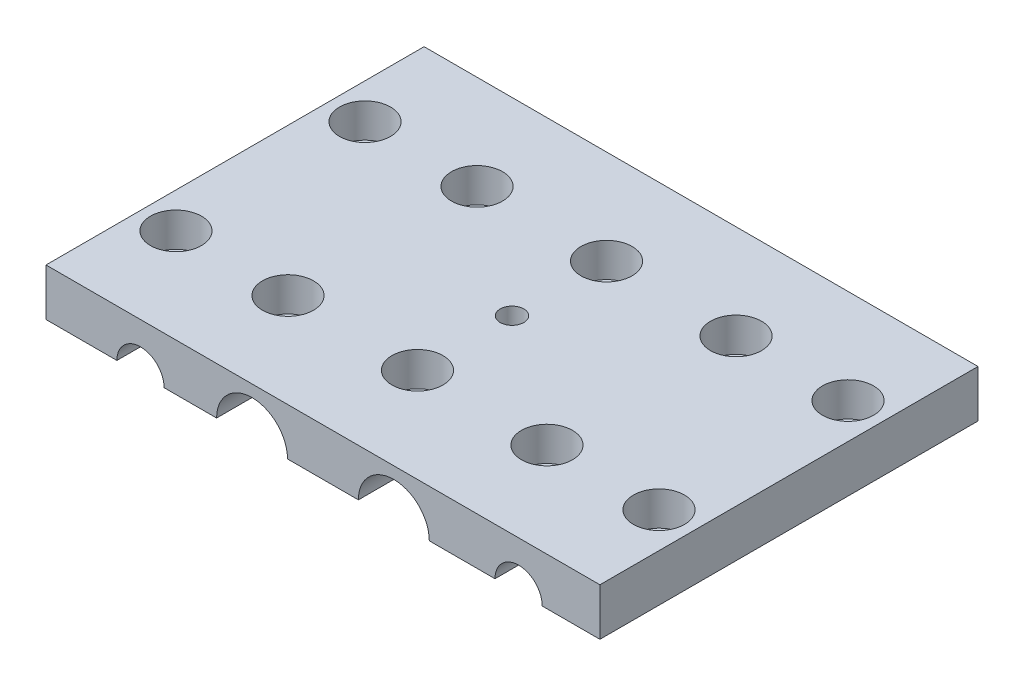
ISO-10303-21;
HEADER;
FILE_DESCRIPTION(('STEP AP214'),'2;1');
FILE_NAME('part.step','',(''),(''),'','','');
FILE_SCHEMA(('AUTOMOTIVE_DESIGN { 1 0 10303 214 1 1 1 1 }'));
ENDSEC;
DATA;
#1=APPLICATION_CONTEXT('core data for automotive mechanical design processes');
#2=APPLICATION_PROTOCOL_DEFINITION('international standard','automotive_design',2000,#1);
#3=PRODUCT_CONTEXT('',#1,'mechanical');
#4=PRODUCT('Part','Part','',(#3));
#5=PRODUCT_RELATED_PRODUCT_CATEGORY('part','',(#4));
#6=PRODUCT_DEFINITION_FORMATION('','',#4);
#7=PRODUCT_DEFINITION_CONTEXT('part definition',#1,'design');
#8=PRODUCT_DEFINITION('design','',#6,#7);
#9=PRODUCT_DEFINITION_SHAPE('','',#8);
#10=(LENGTH_UNIT() NAMED_UNIT(*) SI_UNIT(.MILLI.,.METRE.));
#11=(NAMED_UNIT(*) PLANE_ANGLE_UNIT() SI_UNIT($,.RADIAN.));
#12=(NAMED_UNIT(*) SI_UNIT($,.STERADIAN.) SOLID_ANGLE_UNIT());
#13=UNCERTAINTY_MEASURE_WITH_UNIT(LENGTH_MEASURE(1.E-05),#10,'distance_accuracy_value','');
#14=(GEOMETRIC_REPRESENTATION_CONTEXT(3) GLOBAL_UNCERTAINTY_ASSIGNED_CONTEXT((#13)) GLOBAL_UNIT_ASSIGNED_CONTEXT((#10,
#11,#12)) REPRESENTATION_CONTEXT('',''));
#15=CARTESIAN_POINT('',(0.,0.,0.));
#16=DIRECTION('',(0.,0.,1.));
#17=DIRECTION('',(1.,0.,0.));
#18=AXIS2_PLACEMENT_3D('',#15,#16,#17);
#19=CARTESIAN_POINT('',(-32.4485,6.35,12.7));
#20=DIRECTION('',(0.,1.,0.));
#21=DIRECTION('',(0.,0.,1.));
#22=AXIS2_PLACEMENT_3D('',#19,#20,#21);
#23=CYLINDRICAL_SURFACE('',#22,2.2479);
#24=CARTESIAN_POINT('',(-32.4485,0.,12.7));
#25=DIRECTION('',(0.,1.,0.));
#26=DIRECTION('',(0.,0.,1.));
#27=AXIS2_PLACEMENT_3D('',#24,#25,#26);
#28=CIRCLE('',#27,2.2479);
#29=CARTESIAN_POINT('',(-32.4485,0.,14.9479));
#30=VERTEX_POINT('',#29);
#31=EDGE_CURVE('E338',#30,#30,#28,.T.);
#32=ORIENTED_EDGE('',*,*,#31,.F.);
#33=EDGE_LOOP('',(#32));
#34=FACE_BOUND('',#33,.T.);
#35=CARTESIAN_POINT('',(-32.4485,1.778,12.7));
#36=DIRECTION('',(0.,1.,0.));
#37=DIRECTION('',(0.,0.,1.));
#38=AXIS2_PLACEMENT_3D('',#35,#36,#37);
#39=CIRCLE('',#38,2.2479);
#40=CARTESIAN_POINT('',(-32.4485,1.778,14.9479));
#41=VERTEX_POINT('',#40);
#42=EDGE_CURVE('E46',#41,#41,#39,.F.);
#43=ORIENTED_EDGE('',*,*,#42,.F.);
#44=EDGE_LOOP('',(#43));
#45=FACE_BOUND('',#44,.T.);
#46=ADVANCED_FACE('F42',(#34,#45),#23,.F.);
#47=CARTESIAN_POINT('',(-17.399,6.35,12.7));
#48=DIRECTION('',(0.,1.,0.));
#49=DIRECTION('',(0.,0.,1.));
#50=AXIS2_PLACEMENT_3D('',#47,#48,#49);
#51=CYLINDRICAL_SURFACE('',#50,2.2479);
#52=CARTESIAN_POINT('',(-17.399,0.,12.7));
#53=DIRECTION('',(0.,1.,0.));
#54=DIRECTION('',(0.,0.,1.));
#55=AXIS2_PLACEMENT_3D('',#52,#53,#54);
#56=CIRCLE('',#55,2.2479);
#57=CARTESIAN_POINT('',(-17.399,0.,14.9479));
#58=VERTEX_POINT('',#57);
#59=EDGE_CURVE('E342',#58,#58,#56,.T.);
#60=ORIENTED_EDGE('',*,*,#59,.F.);
#61=EDGE_LOOP('',(#60));
#62=FACE_BOUND('',#61,.T.);
#63=CARTESIAN_POINT('',(-17.399,1.778,12.7));
#64=DIRECTION('',(0.,1.,0.));
#65=DIRECTION('',(0.,0.,1.));
#66=AXIS2_PLACEMENT_3D('',#63,#64,#65);
#67=CIRCLE('',#66,2.2479);
#68=CARTESIAN_POINT('',(-17.399,1.778,14.9479));
#69=VERTEX_POINT('',#68);
#70=EDGE_CURVE('E254',#69,#69,#67,.F.);
#71=ORIENTED_EDGE('',*,*,#70,.F.);
#72=EDGE_LOOP('',(#71));
#73=FACE_BOUND('',#72,.T.);
#74=ADVANCED_FACE('F474',(#62,#73),#51,.F.);
#75=CARTESIAN_POINT('',(0.,6.35,12.7));
#76=DIRECTION('',(0.,1.,0.));
#77=DIRECTION('',(0.,0.,1.));
#78=AXIS2_PLACEMENT_3D('',#75,#76,#77);
#79=CYLINDRICAL_SURFACE('',#78,2.2479);
#80=CARTESIAN_POINT('',(0.,0.,12.7));
#81=DIRECTION('',(0.,1.,0.));
#82=DIRECTION('',(0.,0.,1.));
#83=AXIS2_PLACEMENT_3D('',#80,#81,#82);
#84=CIRCLE('',#83,2.2479);
#85=CARTESIAN_POINT('',(0.,0.,14.9479));
#86=VERTEX_POINT('',#85);
#87=EDGE_CURVE('E346',#86,#86,#84,.T.);
#88=ORIENTED_EDGE('',*,*,#87,.F.);
#89=EDGE_LOOP('',(#88));
#90=FACE_BOUND('',#89,.T.);
#91=CARTESIAN_POINT('',(0.,1.778,12.7));
#92=DIRECTION('',(0.,1.,0.));
#93=DIRECTION('',(0.,0.,1.));
#94=AXIS2_PLACEMENT_3D('',#91,#92,#93);
#95=CIRCLE('',#94,2.2479);
#96=CARTESIAN_POINT('',(0.,1.778,14.9479));
#97=VERTEX_POINT('',#96);
#98=EDGE_CURVE('E249',#97,#97,#95,.F.);
#99=ORIENTED_EDGE('',*,*,#98,.F.);
#100=EDGE_LOOP('',(#99));
#101=FACE_BOUND('',#100,.T.);
#102=ADVANCED_FACE('F480',(#90,#101),#79,.F.);
#103=CARTESIAN_POINT('',(17.399,6.35,12.7));
#104=DIRECTION('',(0.,1.,0.));
#105=DIRECTION('',(0.,0.,1.));
#106=AXIS2_PLACEMENT_3D('',#103,#104,#105);
#107=CYLINDRICAL_SURFACE('',#106,2.2479);
#108=CARTESIAN_POINT('',(17.399,0.,12.7));
#109=DIRECTION('',(0.,1.,0.));
#110=DIRECTION('',(0.,0.,1.));
#111=AXIS2_PLACEMENT_3D('',#108,#109,#110);
#112=CIRCLE('',#111,2.2479);
#113=CARTESIAN_POINT('',(17.399,0.,14.9479));
#114=VERTEX_POINT('',#113);
#115=EDGE_CURVE('E350',#114,#114,#112,.T.);
#116=ORIENTED_EDGE('',*,*,#115,.F.);
#117=EDGE_LOOP('',(#116));
#118=FACE_BOUND('',#117,.T.);
#119=CARTESIAN_POINT('',(17.399,1.778,12.7));
#120=DIRECTION('',(0.,1.,0.));
#121=DIRECTION('',(0.,0.,1.));
#122=AXIS2_PLACEMENT_3D('',#119,#120,#121);
#123=CIRCLE('',#122,2.2479);
#124=CARTESIAN_POINT('',(17.399,1.778,14.9479));
#125=VERTEX_POINT('',#124);
#126=EDGE_CURVE('E243',#125,#125,#123,.F.);
#127=ORIENTED_EDGE('',*,*,#126,.F.);
#128=EDGE_LOOP('',(#127));
#129=FACE_BOUND('',#128,.T.);
#130=ADVANCED_FACE('F491',(#118,#129),#107,.F.);
#131=CARTESIAN_POINT('',(32.4485,6.35,12.7));
#132=DIRECTION('',(0.,1.,0.));
#133=DIRECTION('',(0.,0.,1.));
#134=AXIS2_PLACEMENT_3D('',#131,#132,#133);
#135=CYLINDRICAL_SURFACE('',#134,2.2479);
#136=CARTESIAN_POINT('',(32.4485,0.,12.7));
#137=DIRECTION('',(0.,1.,0.));
#138=DIRECTION('',(0.,0.,1.));
#139=AXIS2_PLACEMENT_3D('',#136,#137,#138);
#140=CIRCLE('',#139,2.2479);
#141=CARTESIAN_POINT('',(32.4485,0.,14.9479));
#142=VERTEX_POINT('',#141);
#143=EDGE_CURVE('E354',#142,#142,#140,.T.);
#144=ORIENTED_EDGE('',*,*,#143,.F.);
#145=EDGE_LOOP('',(#144));
#146=FACE_BOUND('',#145,.T.);
#147=CARTESIAN_POINT('',(32.4485,1.778,12.7));
#148=DIRECTION('',(0.,1.,0.));
#149=DIRECTION('',(0.,0.,1.));
#150=AXIS2_PLACEMENT_3D('',#147,#148,#149);
#151=CIRCLE('',#150,2.2479);
#152=CARTESIAN_POINT('',(32.4485,1.778,14.9479));
#153=VERTEX_POINT('',#152);
#154=EDGE_CURVE('E237',#153,#153,#151,.F.);
#155=ORIENTED_EDGE('',*,*,#154,.F.);
#156=EDGE_LOOP('',(#155));
#157=FACE_BOUND('',#156,.T.);
#158=ADVANCED_FACE('F495',(#146,#157),#135,.F.);
#159=CARTESIAN_POINT('',(32.4485,6.35,-12.7));
#160=DIRECTION('',(0.,1.,0.));
#161=DIRECTION('',(0.,0.,1.));
#162=AXIS2_PLACEMENT_3D('',#159,#160,#161);
#163=CYLINDRICAL_SURFACE('',#162,2.2479);
#164=CARTESIAN_POINT('',(32.4485,0.,-12.7));
#165=DIRECTION('',(0.,1.,0.));
#166=DIRECTION('',(0.,0.,1.));
#167=AXIS2_PLACEMENT_3D('',#164,#165,#166);
#168=CIRCLE('',#167,2.2479);
#169=CARTESIAN_POINT('',(32.4485,0.,-10.4521));
#170=VERTEX_POINT('',#169);
#171=EDGE_CURVE('E358',#170,#170,#168,.T.);
#172=ORIENTED_EDGE('',*,*,#171,.F.);
#173=EDGE_LOOP('',(#172));
#174=FACE_BOUND('',#173,.T.);
#175=CARTESIAN_POINT('',(32.4485,1.778,-12.7));
#176=DIRECTION('',(0.,1.,0.));
#177=DIRECTION('',(0.,0.,1.));
#178=AXIS2_PLACEMENT_3D('',#175,#176,#177);
#179=CIRCLE('',#178,2.2479);
#180=CARTESIAN_POINT('',(32.4485,1.778,-10.4521));
#181=VERTEX_POINT('',#180);
#182=EDGE_CURVE('E231',#181,#181,#179,.F.);
#183=ORIENTED_EDGE('',*,*,#182,.F.);
#184=EDGE_LOOP('',(#183));
#185=FACE_BOUND('',#184,.T.);
#186=ADVANCED_FACE('F499',(#174,#185),#163,.F.);
#187=CARTESIAN_POINT('',(17.399,6.35,-12.7));
#188=DIRECTION('',(0.,1.,0.));
#189=DIRECTION('',(0.,0.,1.));
#190=AXIS2_PLACEMENT_3D('',#187,#188,#189);
#191=CYLINDRICAL_SURFACE('',#190,2.2479);
#192=CARTESIAN_POINT('',(17.399,0.,-12.7));
#193=DIRECTION('',(0.,1.,0.));
#194=DIRECTION('',(0.,0.,1.));
#195=AXIS2_PLACEMENT_3D('',#192,#193,#194);
#196=CIRCLE('',#195,2.2479);
#197=CARTESIAN_POINT('',(17.399,0.,-10.4521));
#198=VERTEX_POINT('',#197);
#199=EDGE_CURVE('E362',#198,#198,#196,.T.);
#200=ORIENTED_EDGE('',*,*,#199,.F.);
#201=EDGE_LOOP('',(#200));
#202=FACE_BOUND('',#201,.T.);
#203=CARTESIAN_POINT('',(17.399,1.778,-12.7));
#204=DIRECTION('',(0.,1.,0.));
#205=DIRECTION('',(0.,0.,1.));
#206=AXIS2_PLACEMENT_3D('',#203,#204,#205);
#207=CIRCLE('',#206,2.2479);
#208=CARTESIAN_POINT('',(17.399,1.778,-10.4521));
#209=VERTEX_POINT('',#208);
#210=EDGE_CURVE('E225',#209,#209,#207,.F.);
#211=ORIENTED_EDGE('',*,*,#210,.F.);
#212=EDGE_LOOP('',(#211));
#213=FACE_BOUND('',#212,.T.);
#214=ADVANCED_FACE('F503',(#202,#213),#191,.F.);
#215=CARTESIAN_POINT('',(0.,6.35,-12.7));
#216=DIRECTION('',(0.,1.,0.));
#217=DIRECTION('',(0.,0.,1.));
#218=AXIS2_PLACEMENT_3D('',#215,#216,#217);
#219=CYLINDRICAL_SURFACE('',#218,2.2479);
#220=CARTESIAN_POINT('',(0.,0.,-12.7));
#221=DIRECTION('',(0.,1.,0.));
#222=DIRECTION('',(0.,0.,1.));
#223=AXIS2_PLACEMENT_3D('',#220,#221,#222);
#224=CIRCLE('',#223,2.2479);
#225=CARTESIAN_POINT('',(0.,0.,-10.4521));
#226=VERTEX_POINT('',#225);
#227=EDGE_CURVE('E366',#226,#226,#224,.T.);
#228=ORIENTED_EDGE('',*,*,#227,.F.);
#229=EDGE_LOOP('',(#228));
#230=FACE_BOUND('',#229,.T.);
#231=CARTESIAN_POINT('',(0.,1.778,-12.7));
#232=DIRECTION('',(0.,1.,0.));
#233=DIRECTION('',(0.,0.,1.));
#234=AXIS2_PLACEMENT_3D('',#231,#232,#233);
#235=CIRCLE('',#234,2.2479);
#236=CARTESIAN_POINT('',(0.,1.778,-10.4521));
#237=VERTEX_POINT('',#236);
#238=EDGE_CURVE('E219',#237,#237,#235,.F.);
#239=ORIENTED_EDGE('',*,*,#238,.F.);
#240=EDGE_LOOP('',(#239));
#241=FACE_BOUND('',#240,.T.);
#242=ADVANCED_FACE('F507',(#230,#241),#219,.F.);
#243=CARTESIAN_POINT('',(-17.399,6.35,-12.7));
#244=DIRECTION('',(0.,1.,0.));
#245=DIRECTION('',(0.,0.,1.));
#246=AXIS2_PLACEMENT_3D('',#243,#244,#245);
#247=CYLINDRICAL_SURFACE('',#246,2.2479);
#248=CARTESIAN_POINT('',(-17.399,0.,-12.7));
#249=DIRECTION('',(0.,1.,0.));
#250=DIRECTION('',(0.,0.,1.));
#251=AXIS2_PLACEMENT_3D('',#248,#249,#250);
#252=CIRCLE('',#251,2.2479);
#253=CARTESIAN_POINT('',(-17.399,0.,-10.4521));
#254=VERTEX_POINT('',#253);
#255=EDGE_CURVE('E370',#254,#254,#252,.T.);
#256=ORIENTED_EDGE('',*,*,#255,.F.);
#257=EDGE_LOOP('',(#256));
#258=FACE_BOUND('',#257,.T.);
#259=CARTESIAN_POINT('',(-17.399,1.778,-12.7));
#260=DIRECTION('',(0.,1.,0.));
#261=DIRECTION('',(0.,0.,1.));
#262=AXIS2_PLACEMENT_3D('',#259,#260,#261);
#263=CIRCLE('',#262,2.2479);
#264=CARTESIAN_POINT('',(-17.399,1.778,-10.4521));
#265=VERTEX_POINT('',#264);
#266=EDGE_CURVE('E213',#265,#265,#263,.F.);
#267=ORIENTED_EDGE('',*,*,#266,.F.);
#268=EDGE_LOOP('',(#267));
#269=FACE_BOUND('',#268,.T.);
#270=ADVANCED_FACE('F511',(#258,#269),#247,.F.);
#271=CARTESIAN_POINT('',(-32.4485,6.35,-12.7));
#272=DIRECTION('',(0.,1.,0.));
#273=DIRECTION('',(0.,0.,1.));
#274=AXIS2_PLACEMENT_3D('',#271,#272,#273);
#275=CYLINDRICAL_SURFACE('',#274,2.2479);
#276=CARTESIAN_POINT('',(-32.4485,0.,-12.7));
#277=DIRECTION('',(0.,1.,0.));
#278=DIRECTION('',(0.,0.,1.));
#279=AXIS2_PLACEMENT_3D('',#276,#277,#278);
#280=CIRCLE('',#279,2.2479);
#281=CARTESIAN_POINT('',(-32.4485,0.,-10.4521));
#282=VERTEX_POINT('',#281);
#283=EDGE_CURVE('E211',#282,#282,#280,.T.);
#284=ORIENTED_EDGE('',*,*,#283,.F.);
#285=EDGE_LOOP('',(#284));
#286=FACE_BOUND('',#285,.T.);
#287=CARTESIAN_POINT('',(-32.4485,1.778,-12.7));
#288=DIRECTION('',(0.,1.,0.));
#289=DIRECTION('',(0.,0.,1.));
#290=AXIS2_PLACEMENT_3D('',#287,#288,#289);
#291=CIRCLE('',#290,2.2479);
#292=CARTESIAN_POINT('',(-32.4485,1.778,-10.4521));
#293=VERTEX_POINT('',#292);
#294=EDGE_CURVE('E207',#293,#293,#291,.F.);
#295=ORIENTED_EDGE('',*,*,#294,.F.);
#296=EDGE_LOOP('',(#295));
#297=FACE_BOUND('',#296,.T.);
#298=ADVANCED_FACE('F486',(#286,#297),#275,.F.);
#299=CARTESIAN_POINT('',(0.,0.,0.));
#300=DIRECTION('',(0.,1.,0.));
#301=DIRECTION('',(0.,0.,1.));
#302=AXIS2_PLACEMENT_3D('',#299,#300,#301);
#303=PLANE('',#302);
#304=CARTESIAN_POINT('',(0.,0.,0.));
#305=DIRECTION('',(0.,1.,0.));
#306=DIRECTION('',(0.,0.,1.));
#307=AXIS2_PLACEMENT_3D('',#304,#305,#306);
#308=CIRCLE('',#307,1.5875);
#309=CARTESIAN_POINT('',(0.,0.,1.5875));
#310=VERTEX_POINT('',#309);
#311=EDGE_CURVE('E909',#310,#310,#308,.T.);
#312=ORIENTED_EDGE('',*,*,#311,.T.);
#313=EDGE_LOOP('',(#312));
#314=FACE_BOUND('',#313,.T.);
#315=ORIENTED_EDGE('',*,*,#87,.T.);
#316=EDGE_LOOP('',(#315));
#317=FACE_BOUND('',#316,.T.);
#318=ORIENTED_EDGE('',*,*,#227,.T.);
#319=EDGE_LOOP('',(#318));
#320=FACE_BOUND('',#319,.T.);
#321=DIRECTION('',(-1.,0.,0.));
#322=VECTOR('',#321,1.);
#323=CARTESIAN_POINT('',(-37.211,0.,-25.4));
#324=LINE('',#323,#322);
#325=CARTESIAN_POINT('',(4.7625,0.,-25.4));
#326=VERTEX_POINT('',#325);
#327=CARTESIAN_POINT('',(-4.7625,0.,-25.4));
#328=VERTEX_POINT('',#327);
#329=EDGE_CURVE('E159',#326,#328,#324,.T.);
#330=ORIENTED_EDGE('',*,*,#329,.F.);
#331=DIRECTION('',(0.,0.,1.));
#332=VECTOR('',#331,1.);
#333=CARTESIAN_POINT('',(4.7625,0.,-25.4));
#334=LINE('',#333,#332);
#335=CARTESIAN_POINT('',(4.7625,0.,25.4));
#336=VERTEX_POINT('',#335);
#337=EDGE_CURVE('E60',#326,#336,#334,.T.);
#338=ORIENTED_EDGE('',*,*,#337,.T.);
#339=DIRECTION('',(1.,0.,0.));
#340=VECTOR('',#339,1.);
#341=CARTESIAN_POINT('',(-37.211,0.,25.4));
#342=LINE('',#341,#340);
#343=CARTESIAN_POINT('',(-4.7625,0.,25.4));
#344=VERTEX_POINT('',#343);
#345=EDGE_CURVE('E442',#344,#336,#342,.T.);
#346=ORIENTED_EDGE('',*,*,#345,.F.);
#347=DIRECTION('',(0.,0.,1.));
#348=VECTOR('',#347,1.);
#349=CARTESIAN_POINT('',(-4.7625,0.,-25.4));
#350=LINE('',#349,#348);
#351=EDGE_CURVE('E381',#344,#328,#350,.F.);
#352=ORIENTED_EDGE('',*,*,#351,.T.);
#353=EDGE_LOOP('',(#330,#338,#346,#352));
#354=FACE_BOUND('',#353,.T.);
#355=ADVANCED_FACE('F468',(#314,#317,#320,#354),#303,.F.);
#356=ORIENTED_EDGE('',*,*,#59,.T.);
#357=EDGE_LOOP('',(#356));
#358=FACE_BOUND('',#357,.T.);
#359=ORIENTED_EDGE('',*,*,#255,.T.);
#360=EDGE_LOOP('',(#359));
#361=FACE_BOUND('',#360,.T.);
#362=CARTESIAN_POINT('',(-14.2875,0.,-25.4));
#363=VERTEX_POINT('',#362);
#364=CARTESIAN_POINT('',(-21.336,0.,-25.4));
#365=VERTEX_POINT('',#364);
#366=EDGE_CURVE('E162',#363,#365,#324,.T.);
#367=ORIENTED_EDGE('',*,*,#366,.F.);
#368=DIRECTION('',(0.,0.,1.));
#369=VECTOR('',#368,1.);
#370=CARTESIAN_POINT('',(-14.2875,0.,-25.4));
#371=LINE('',#370,#369);
#372=CARTESIAN_POINT('',(-14.2875,0.,25.4));
#373=VERTEX_POINT('',#372);
#374=EDGE_CURVE('E68',#363,#373,#371,.T.);
#375=ORIENTED_EDGE('',*,*,#374,.T.);
#376=CARTESIAN_POINT('',(-21.336,0.,25.4));
#377=VERTEX_POINT('',#376);
#378=EDGE_CURVE('E192',#377,#373,#342,.T.);
#379=ORIENTED_EDGE('',*,*,#378,.F.);
#380=DIRECTION('',(0.,0.,1.));
#381=VECTOR('',#380,1.);
#382=CARTESIAN_POINT('',(-21.336,0.,-25.4));
#383=LINE('',#382,#381);
#384=EDGE_CURVE('E181',#377,#365,#383,.F.);
#385=ORIENTED_EDGE('',*,*,#384,.T.);
#386=EDGE_LOOP('',(#367,#375,#379,#385));
#387=FACE_BOUND('',#386,.T.);
#388=ADVANCED_FACE('F190',(#358,#361,#387),#303,.F.);
#389=ORIENTED_EDGE('',*,*,#115,.T.);
#390=EDGE_LOOP('',(#389));
#391=FACE_BOUND('',#390,.T.);
#392=ORIENTED_EDGE('',*,*,#199,.T.);
#393=EDGE_LOOP('',(#392));
#394=FACE_BOUND('',#393,.T.);
#395=CARTESIAN_POINT('',(14.2875,0.,25.4));
#396=VERTEX_POINT('',#395);
#397=CARTESIAN_POINT('',(23.114,0.,25.4));
#398=VERTEX_POINT('',#397);
#399=EDGE_CURVE('E150',#396,#398,#342,.T.);
#400=ORIENTED_EDGE('',*,*,#399,.F.);
#401=DIRECTION('',(0.,0.,1.));
#402=VECTOR('',#401,1.);
#403=CARTESIAN_POINT('',(14.2875,0.,-25.4));
#404=LINE('',#403,#402);
#405=CARTESIAN_POINT('',(14.2875,0.,-25.4));
#406=VERTEX_POINT('',#405);
#407=EDGE_CURVE('E137',#396,#406,#404,.F.);
#408=ORIENTED_EDGE('',*,*,#407,.T.);
#409=CARTESIAN_POINT('',(23.114,0.,-25.4));
#410=VERTEX_POINT('',#409);
#411=EDGE_CURVE('E149',#410,#406,#324,.T.);
#412=ORIENTED_EDGE('',*,*,#411,.F.);
#413=DIRECTION('',(0.,0.,1.));
#414=VECTOR('',#413,1.);
#415=CARTESIAN_POINT('',(23.114,0.,-25.4));
#416=LINE('',#415,#414);
#417=EDGE_CURVE('E12',#410,#398,#416,.T.);
#418=ORIENTED_EDGE('',*,*,#417,.T.);
#419=EDGE_LOOP('',(#400,#408,#412,#418));
#420=FACE_BOUND('',#419,.T.);
#421=ADVANCED_FACE('F148',(#391,#394,#420),#303,.F.);
#422=ORIENTED_EDGE('',*,*,#283,.T.);
#423=EDGE_LOOP('',(#422));
#424=FACE_BOUND('',#423,.T.);
#425=ORIENTED_EDGE('',*,*,#31,.T.);
#426=EDGE_LOOP('',(#425));
#427=FACE_BOUND('',#426,.T.);
#428=CARTESIAN_POINT('',(-27.686,0.,-25.4));
#429=VERTEX_POINT('',#428);
#430=CARTESIAN_POINT('',(-37.211,0.,-25.4));
#431=VERTEX_POINT('',#430);
#432=EDGE_CURVE('E161',#429,#431,#324,.T.);
#433=ORIENTED_EDGE('',*,*,#432,.F.);
#434=DIRECTION('',(0.,0.,1.));
#435=VECTOR('',#434,1.);
#436=CARTESIAN_POINT('',(-27.686,0.,-25.4));
#437=LINE('',#436,#435);
#438=CARTESIAN_POINT('',(-27.686,0.,25.4));
#439=VERTEX_POINT('',#438);
#440=EDGE_CURVE('E184',#429,#439,#437,.T.);
#441=ORIENTED_EDGE('',*,*,#440,.T.);
#442=CARTESIAN_POINT('',(-37.211,0.,25.4));
#443=VERTEX_POINT('',#442);
#444=EDGE_CURVE('E414',#443,#439,#342,.T.);
#445=ORIENTED_EDGE('',*,*,#444,.F.);
#446=DIRECTION('',(0.,0.,1.));
#447=VECTOR('',#446,1.);
#448=CARTESIAN_POINT('',(-37.211,0.,-25.4));
#449=LINE('',#448,#447);
#450=EDGE_CURVE('E186',#431,#443,#449,.T.);
#451=ORIENTED_EDGE('',*,*,#450,.F.);
#452=EDGE_LOOP('',(#433,#441,#445,#451));
#453=FACE_BOUND('',#452,.T.);
#454=ADVANCED_FACE('F449',(#424,#427,#453),#303,.F.);
#455=CARTESIAN_POINT('',(-37.211,6.35,-25.4));
#456=DIRECTION('',(1.,0.,0.));
#457=DIRECTION('',(0.,0.,-1.));
#458=AXIS2_PLACEMENT_3D('',#455,#456,#457);
#459=PLANE('',#458);
#460=ORIENTED_EDGE('',*,*,#450,.T.);
#461=DIRECTION('',(0.,-1.,0.));
#462=VECTOR('',#461,1.);
#463=CARTESIAN_POINT('',(-37.211,6.35,25.4));
#464=LINE('',#463,#462);
#465=CARTESIAN_POINT('',(-37.211,6.35,25.4));
#466=VERTEX_POINT('',#465);
#467=EDGE_CURVE('E194',#466,#443,#464,.T.);
#468=ORIENTED_EDGE('',*,*,#467,.F.);
#469=DIRECTION('',(0.,0.,1.));
#470=VECTOR('',#469,1.);
#471=CARTESIAN_POINT('',(-37.211,6.35,-25.4));
#472=LINE('',#471,#470);
#473=CARTESIAN_POINT('',(-37.211,6.35,-25.4));
#474=VERTEX_POINT('',#473);
#475=EDGE_CURVE('E165',#474,#466,#472,.T.);
#476=ORIENTED_EDGE('',*,*,#475,.F.);
#477=DIRECTION('',(0.,-1.,0.));
#478=VECTOR('',#477,1.);
#479=CARTESIAN_POINT('',(-37.211,6.35,-25.4));
#480=LINE('',#479,#478);
#481=EDGE_CURVE('E409',#474,#431,#480,.T.);
#482=ORIENTED_EDGE('',*,*,#481,.T.);
#483=EDGE_LOOP('',(#460,#468,#476,#482));
#484=FACE_BOUND('',#483,.T.);
#485=ADVANCED_FACE('F44',(#484),#459,.F.);
#486=CARTESIAN_POINT('',(-37.211,6.35,25.4));
#487=DIRECTION('',(0.,0.,-1.));
#488=DIRECTION('',(-1.,0.,0.));
#489=AXIS2_PLACEMENT_3D('',#486,#487,#488);
#490=PLANE('',#489);
#491=ORIENTED_EDGE('',*,*,#345,.T.);
#492=CARTESIAN_POINT('',(9.525,0.,25.4));
#493=DIRECTION('',(0.,0.,1.));
#494=DIRECTION('',(1.,0.,0.));
#495=AXIS2_PLACEMENT_3D('',#492,#493,#494);
#496=CIRCLE('',#495,4.7625);
#497=EDGE_CURVE('E143',#396,#336,#496,.T.);
#498=ORIENTED_EDGE('',*,*,#497,.F.);
#499=ORIENTED_EDGE('',*,*,#399,.T.);
#500=CARTESIAN_POINT('',(26.289,0.,25.4));
#501=DIRECTION('',(0.,0.,1.));
#502=DIRECTION('',(1.,0.,0.));
#503=AXIS2_PLACEMENT_3D('',#500,#501,#502);
#504=CIRCLE('',#503,3.175);
#505=CARTESIAN_POINT('',(29.464,0.,25.4));
#506=VERTEX_POINT('',#505);
#507=EDGE_CURVE('E389',#506,#398,#504,.T.);
#508=ORIENTED_EDGE('',*,*,#507,.F.);
#509=CARTESIAN_POINT('',(37.211,0.,25.4));
#510=VERTEX_POINT('',#509);
#511=EDGE_CURVE('E413',#506,#510,#342,.T.);
#512=ORIENTED_EDGE('',*,*,#511,.T.);
#513=DIRECTION('',(0.,-1.,0.));
#514=VECTOR('',#513,1.);
#515=CARTESIAN_POINT('',(37.211,6.35,25.4));
#516=LINE('',#515,#514);
#517=CARTESIAN_POINT('',(37.211,6.35,25.4));
#518=VERTEX_POINT('',#517);
#519=EDGE_CURVE('E200',#518,#510,#516,.T.);
#520=ORIENTED_EDGE('',*,*,#519,.F.);
#521=DIRECTION('',(1.,0.,0.));
#522=VECTOR('',#521,1.);
#523=CARTESIAN_POINT('',(-37.211,6.35,25.4));
#524=LINE('',#523,#522);
#525=EDGE_CURVE('E400',#466,#518,#524,.T.);
#526=ORIENTED_EDGE('',*,*,#525,.F.);
#527=ORIENTED_EDGE('',*,*,#467,.T.);
#528=ORIENTED_EDGE('',*,*,#444,.T.);
#529=CARTESIAN_POINT('',(-24.511,0.,25.4));
#530=DIRECTION('',(0.,0.,1.));
#531=DIRECTION('',(1.,0.,0.));
#532=AXIS2_PLACEMENT_3D('',#529,#530,#531);
#533=CIRCLE('',#532,3.175);
#534=EDGE_CURVE('E187',#377,#439,#533,.T.);
#535=ORIENTED_EDGE('',*,*,#534,.F.);
#536=ORIENTED_EDGE('',*,*,#378,.T.);
#537=CARTESIAN_POINT('',(-9.525,0.,25.4));
#538=DIRECTION('',(0.,0.,1.));
#539=DIRECTION('',(1.,0.,0.));
#540=AXIS2_PLACEMENT_3D('',#537,#538,#539);
#541=CIRCLE('',#540,4.7625);
#542=EDGE_CURVE('E378',#344,#373,#541,.T.);
#543=ORIENTED_EDGE('',*,*,#542,.F.);
#544=EDGE_LOOP('',(#491,#498,#499,#508,#512,#520,#526,#527,#528,#535,#536,#543));
#545=FACE_BOUND('',#544,.T.);
#546=ADVANCED_FACE('F440',(#545),#490,.F.);
#547=CARTESIAN_POINT('',(37.211,6.35,-25.4));
#548=DIRECTION('',(-1.,0.,0.));
#549=DIRECTION('',(0.,0.,1.));
#550=AXIS2_PLACEMENT_3D('',#547,#548,#549);
#551=PLANE('',#550);
#552=DIRECTION('',(0.,0.,-1.));
#553=VECTOR('',#552,1.);
#554=CARTESIAN_POINT('',(37.211,0.,-25.4));
#555=LINE('',#554,#553);
#556=CARTESIAN_POINT('',(37.211,0.,-25.4));
#557=VERTEX_POINT('',#556);
#558=EDGE_CURVE('E169',#510,#557,#555,.T.);
#559=ORIENTED_EDGE('',*,*,#558,.T.);
#560=DIRECTION('',(0.,-1.,0.));
#561=VECTOR('',#560,1.);
#562=CARTESIAN_POINT('',(37.211,6.35,-25.4));
#563=LINE('',#562,#561);
#564=CARTESIAN_POINT('',(37.211,6.35,-25.4));
#565=VERTEX_POINT('',#564);
#566=EDGE_CURVE('E425',#565,#557,#563,.T.);
#567=ORIENTED_EDGE('',*,*,#566,.F.);
#568=DIRECTION('',(0.,0.,-1.));
#569=VECTOR('',#568,1.);
#570=CARTESIAN_POINT('',(37.211,6.35,-25.4));
#571=LINE('',#570,#569);
#572=EDGE_CURVE('E403',#518,#565,#571,.T.);
#573=ORIENTED_EDGE('',*,*,#572,.F.);
#574=ORIENTED_EDGE('',*,*,#519,.T.);
#575=EDGE_LOOP('',(#559,#567,#573,#574));
#576=FACE_BOUND('',#575,.T.);
#577=ADVANCED_FACE('F423',(#576),#551,.F.);
#578=CARTESIAN_POINT('',(-37.211,6.35,-25.4));
#579=DIRECTION('',(0.,0.,1.));
#580=DIRECTION('',(1.,0.,0.));
#581=AXIS2_PLACEMENT_3D('',#578,#579,#580);
#582=PLANE('',#581);
#583=ORIENTED_EDGE('',*,*,#411,.T.);
#584=CARTESIAN_POINT('',(9.525,0.,-25.4));
#585=DIRECTION('',(0.,0.,1.));
#586=DIRECTION('',(1.,0.,0.));
#587=AXIS2_PLACEMENT_3D('',#584,#585,#586);
#588=CIRCLE('',#587,4.7625);
#589=EDGE_CURVE('E134',#406,#326,#588,.T.);
#590=ORIENTED_EDGE('',*,*,#589,.T.);
#591=ORIENTED_EDGE('',*,*,#329,.T.);
#592=CARTESIAN_POINT('',(-9.525,0.,-25.4));
#593=DIRECTION('',(0.,0.,1.));
#594=DIRECTION('',(1.,0.,0.));
#595=AXIS2_PLACEMENT_3D('',#592,#593,#594);
#596=CIRCLE('',#595,4.7625);
#597=EDGE_CURVE('E176',#328,#363,#596,.T.);
#598=ORIENTED_EDGE('',*,*,#597,.T.);
#599=ORIENTED_EDGE('',*,*,#366,.T.);
#600=CARTESIAN_POINT('',(-24.511,0.,-25.4));
#601=DIRECTION('',(0.,0.,1.));
#602=DIRECTION('',(1.,0.,0.));
#603=AXIS2_PLACEMENT_3D('',#600,#601,#602);
#604=CIRCLE('',#603,3.175);
#605=EDGE_CURVE('E174',#365,#429,#604,.T.);
#606=ORIENTED_EDGE('',*,*,#605,.T.);
#607=ORIENTED_EDGE('',*,*,#432,.T.);
#608=ORIENTED_EDGE('',*,*,#481,.F.);
#609=DIRECTION('',(-1.,0.,0.));
#610=VECTOR('',#609,1.);
#611=CARTESIAN_POINT('',(-37.211,6.35,-25.4));
#612=LINE('',#611,#610);
#613=EDGE_CURVE('E406',#565,#474,#612,.T.);
#614=ORIENTED_EDGE('',*,*,#613,.F.);
#615=ORIENTED_EDGE('',*,*,#566,.T.);
#616=CARTESIAN_POINT('',(29.464,0.,-25.4));
#617=VERTEX_POINT('',#616);
#618=EDGE_CURVE('E158',#557,#617,#324,.T.);
#619=ORIENTED_EDGE('',*,*,#618,.T.);
#620=CARTESIAN_POINT('',(26.289,0.,-25.4));
#621=DIRECTION('',(0.,0.,1.));
#622=DIRECTION('',(1.,0.,0.));
#623=AXIS2_PLACEMENT_3D('',#620,#621,#622);
#624=CIRCLE('',#623,3.175);
#625=EDGE_CURVE('E156',#617,#410,#624,.T.);
#626=ORIENTED_EDGE('',*,*,#625,.T.);
#627=EDGE_LOOP('',(#583,#590,#591,#598,#599,#606,#607,#608,#614,#615,#619,#626));
#628=FACE_BOUND('',#627,.T.);
#629=ADVANCED_FACE('F154',(#628),#582,.F.);
#630=CARTESIAN_POINT('',(0.,6.35,0.));
#631=DIRECTION('',(0.,1.,0.));
#632=DIRECTION('',(0.,0.,1.));
#633=AXIS2_PLACEMENT_3D('',#630,#631,#632);
#634=PLANE('',#633);
#635=CARTESIAN_POINT('',(0.,6.35,0.));
#636=DIRECTION('',(0.,1.,0.));
#637=DIRECTION('',(0.,0.,1.));
#638=AXIS2_PLACEMENT_3D('',#635,#636,#637);
#639=CIRCLE('',#638,1.5875);
#640=CARTESIAN_POINT('',(0.,6.35,1.5875));
#641=VERTEX_POINT('',#640);
#642=EDGE_CURVE('E921',#641,#641,#639,.T.);
#643=ORIENTED_EDGE('',*,*,#642,.F.);
#644=EDGE_LOOP('',(#643));
#645=FACE_BOUND('',#644,.T.);
#646=CARTESIAN_POINT('',(-32.4485,6.35,12.7));
#647=DIRECTION('',(0.,1.,0.));
#648=DIRECTION('',(0.,0.,1.));
#649=AXIS2_PLACEMENT_3D('',#646,#647,#648);
#650=CIRCLE('',#649,3.429);
#651=CARTESIAN_POINT('',(-32.4485,6.35,16.129));
#652=VERTEX_POINT('',#651);
#653=EDGE_CURVE('E277',#652,#652,#650,.T.);
#654=ORIENTED_EDGE('',*,*,#653,.F.);
#655=EDGE_LOOP('',(#654));
#656=FACE_BOUND('',#655,.T.);
#657=CARTESIAN_POINT('',(-17.399,6.35,12.7));
#658=DIRECTION('',(0.,1.,0.));
#659=DIRECTION('',(0.,0.,1.));
#660=AXIS2_PLACEMENT_3D('',#657,#658,#659);
#661=CIRCLE('',#660,3.429);
#662=CARTESIAN_POINT('',(-17.399,6.35,16.129));
#663=VERTEX_POINT('',#662);
#664=EDGE_CURVE('E267',#663,#663,#661,.T.);
#665=ORIENTED_EDGE('',*,*,#664,.F.);
#666=EDGE_LOOP('',(#665));
#667=FACE_BOUND('',#666,.T.);
#668=CARTESIAN_POINT('',(0.,6.35,12.7));
#669=DIRECTION('',(0.,1.,0.));
#670=DIRECTION('',(0.,0.,1.));
#671=AXIS2_PLACEMENT_3D('',#668,#669,#670);
#672=CIRCLE('',#671,3.429);
#673=CARTESIAN_POINT('',(0.,6.35,16.129));
#674=VERTEX_POINT('',#673);
#675=EDGE_CURVE('E257',#674,#674,#672,.T.);
#676=ORIENTED_EDGE('',*,*,#675,.F.);
#677=EDGE_LOOP('',(#676));
#678=FACE_BOUND('',#677,.T.);
#679=CARTESIAN_POINT('',(17.399,6.35,12.7));
#680=DIRECTION('',(0.,1.,0.));
#681=DIRECTION('',(0.,0.,1.));
#682=AXIS2_PLACEMENT_3D('',#679,#680,#681);
#683=CIRCLE('',#682,3.429);
#684=CARTESIAN_POINT('',(17.399,6.35,16.129));
#685=VERTEX_POINT('',#684);
#686=EDGE_CURVE('E252',#685,#685,#683,.T.);
#687=ORIENTED_EDGE('',*,*,#686,.F.);
#688=EDGE_LOOP('',(#687));
#689=FACE_BOUND('',#688,.T.);
#690=CARTESIAN_POINT('',(32.4485,6.35,12.7));
#691=DIRECTION('',(0.,1.,0.));
#692=DIRECTION('',(0.,0.,1.));
#693=AXIS2_PLACEMENT_3D('',#690,#691,#692);
#694=CIRCLE('',#693,3.429);
#695=CARTESIAN_POINT('',(32.4485,6.35,16.129));
#696=VERTEX_POINT('',#695);
#697=EDGE_CURVE('E247',#696,#696,#694,.T.);
#698=ORIENTED_EDGE('',*,*,#697,.F.);
#699=EDGE_LOOP('',(#698));
#700=FACE_BOUND('',#699,.T.);
#701=CARTESIAN_POINT('',(32.4485,6.35,-12.7));
#702=DIRECTION('',(0.,1.,0.));
#703=DIRECTION('',(0.,0.,1.));
#704=AXIS2_PLACEMENT_3D('',#701,#702,#703);
#705=CIRCLE('',#704,3.429);
#706=CARTESIAN_POINT('',(32.4485,6.35,-9.271));
#707=VERTEX_POINT('',#706);
#708=EDGE_CURVE('E241',#707,#707,#705,.T.);
#709=ORIENTED_EDGE('',*,*,#708,.F.);
#710=EDGE_LOOP('',(#709));
#711=FACE_BOUND('',#710,.T.);
#712=CARTESIAN_POINT('',(17.399,6.35,-12.7));
#713=DIRECTION('',(0.,1.,0.));
#714=DIRECTION('',(0.,0.,1.));
#715=AXIS2_PLACEMENT_3D('',#712,#713,#714);
#716=CIRCLE('',#715,3.429);
#717=CARTESIAN_POINT('',(17.399,6.35,-9.27099999999999));
#718=VERTEX_POINT('',#717);
#719=EDGE_CURVE('E235',#718,#718,#716,.T.);
#720=ORIENTED_EDGE('',*,*,#719,.F.);
#721=EDGE_LOOP('',(#720));
#722=FACE_BOUND('',#721,.T.);
#723=CARTESIAN_POINT('',(0.,6.35,-12.7));
#724=DIRECTION('',(0.,1.,0.));
#725=DIRECTION('',(0.,0.,1.));
#726=AXIS2_PLACEMENT_3D('',#723,#724,#725);
#727=CIRCLE('',#726,3.429);
#728=CARTESIAN_POINT('',(0.,6.35,-9.271));
#729=VERTEX_POINT('',#728);
#730=EDGE_CURVE('E229',#729,#729,#727,.T.);
#731=ORIENTED_EDGE('',*,*,#730,.F.);
#732=EDGE_LOOP('',(#731));
#733=FACE_BOUND('',#732,.T.);
#734=CARTESIAN_POINT('',(-17.399,6.35,-12.7));
#735=DIRECTION('',(0.,1.,0.));
#736=DIRECTION('',(0.,0.,1.));
#737=AXIS2_PLACEMENT_3D('',#734,#735,#736);
#738=CIRCLE('',#737,3.429);
#739=CARTESIAN_POINT('',(-17.399,6.35,-9.271));
#740=VERTEX_POINT('',#739);
#741=EDGE_CURVE('E223',#740,#740,#738,.T.);
#742=ORIENTED_EDGE('',*,*,#741,.F.);
#743=EDGE_LOOP('',(#742));
#744=FACE_BOUND('',#743,.T.);
#745=CARTESIAN_POINT('',(-32.4485,6.35,-12.7));
#746=DIRECTION('',(0.,1.,0.));
#747=DIRECTION('',(0.,0.,1.));
#748=AXIS2_PLACEMENT_3D('',#745,#746,#747);
#749=CIRCLE('',#748,3.429);
#750=CARTESIAN_POINT('',(-32.4485,6.35,-9.27099999999999));
#751=VERTEX_POINT('',#750);
#752=EDGE_CURVE('E217',#751,#751,#749,.T.);
#753=ORIENTED_EDGE('',*,*,#752,.F.);
#754=EDGE_LOOP('',(#753));
#755=FACE_BOUND('',#754,.T.);
#756=ORIENTED_EDGE('',*,*,#475,.T.);
#757=ORIENTED_EDGE('',*,*,#525,.T.);
#758=ORIENTED_EDGE('',*,*,#572,.T.);
#759=ORIENTED_EDGE('',*,*,#613,.T.);
#760=EDGE_LOOP('',(#756,#757,#758,#759));
#761=FACE_BOUND('',#760,.T.);
#762=ADVANCED_FACE('F458',(#645,#656,#667,#678,#689,#700,#711,#722,#733,#744,#755,#761),#634,.T.);
#763=ORIENTED_EDGE('',*,*,#143,.T.);
#764=EDGE_LOOP('',(#763));
#765=FACE_BOUND('',#764,.T.);
#766=ORIENTED_EDGE('',*,*,#171,.T.);
#767=EDGE_LOOP('',(#766));
#768=FACE_BOUND('',#767,.T.);
#769=ORIENTED_EDGE('',*,*,#511,.F.);
#770=DIRECTION('',(0.,0.,1.));
#771=VECTOR('',#770,1.);
#772=CARTESIAN_POINT('',(29.464,0.,-25.4));
#773=LINE('',#772,#771);
#774=EDGE_CURVE('E52',#506,#617,#773,.F.);
#775=ORIENTED_EDGE('',*,*,#774,.T.);
#776=ORIENTED_EDGE('',*,*,#618,.F.);
#777=ORIENTED_EDGE('',*,*,#558,.F.);
#778=EDGE_LOOP('',(#769,#775,#776,#777));
#779=FACE_BOUND('',#778,.T.);
#780=ADVANCED_FACE('F434',(#765,#768,#779),#303,.F.);
#781=CARTESIAN_POINT('',(-24.511,0.,-25.4));
#782=DIRECTION('',(0.,0.,1.));
#783=DIRECTION('',(1.,0.,0.));
#784=AXIS2_PLACEMENT_3D('',#781,#782,#783);
#785=CYLINDRICAL_SURFACE('',#784,3.175);
#786=ORIENTED_EDGE('',*,*,#605,.F.);
#787=ORIENTED_EDGE('',*,*,#384,.F.);
#788=ORIENTED_EDGE('',*,*,#534,.T.);
#789=ORIENTED_EDGE('',*,*,#440,.F.);
#790=EDGE_LOOP('',(#786,#787,#788,#789));
#791=FACE_BOUND('',#790,.T.);
#792=ADVANCED_FACE('F180',(#791),#785,.F.);
#793=CARTESIAN_POINT('',(26.289,0.,-25.4));
#794=DIRECTION('',(0.,0.,1.));
#795=DIRECTION('',(1.,0.,0.));
#796=AXIS2_PLACEMENT_3D('',#793,#794,#795);
#797=CYLINDRICAL_SURFACE('',#796,3.175);
#798=ORIENTED_EDGE('',*,*,#625,.F.);
#799=ORIENTED_EDGE('',*,*,#774,.F.);
#800=ORIENTED_EDGE('',*,*,#507,.T.);
#801=ORIENTED_EDGE('',*,*,#417,.F.);
#802=EDGE_LOOP('',(#798,#799,#800,#801));
#803=FACE_BOUND('',#802,.T.);
#804=ADVANCED_FACE('F437',(#803),#797,.F.);
#805=CARTESIAN_POINT('',(-9.525,0.,-25.4));
#806=DIRECTION('',(0.,0.,1.));
#807=DIRECTION('',(1.,0.,0.));
#808=AXIS2_PLACEMENT_3D('',#805,#806,#807);
#809=CYLINDRICAL_SURFACE('',#808,4.7625);
#810=ORIENTED_EDGE('',*,*,#597,.F.);
#811=ORIENTED_EDGE('',*,*,#351,.F.);
#812=ORIENTED_EDGE('',*,*,#542,.T.);
#813=ORIENTED_EDGE('',*,*,#374,.F.);
#814=EDGE_LOOP('',(#810,#811,#812,#813));
#815=FACE_BOUND('',#814,.T.);
#816=ADVANCED_FACE('F519',(#815),#809,.F.);
#817=CARTESIAN_POINT('',(9.525,0.,-25.4));
#818=DIRECTION('',(0.,0.,1.));
#819=DIRECTION('',(1.,0.,0.));
#820=AXIS2_PLACEMENT_3D('',#817,#818,#819);
#821=CYLINDRICAL_SURFACE('',#820,4.7625);
#822=ORIENTED_EDGE('',*,*,#589,.F.);
#823=ORIENTED_EDGE('',*,*,#407,.F.);
#824=ORIENTED_EDGE('',*,*,#497,.T.);
#825=ORIENTED_EDGE('',*,*,#337,.F.);
#826=EDGE_LOOP('',(#822,#823,#824,#825));
#827=FACE_BOUND('',#826,.T.);
#828=ADVANCED_FACE('F136',(#827),#821,.F.);
#829=CARTESIAN_POINT('',(-32.4485,1.778,-12.7));
#830=DIRECTION('',(0.,1.,0.));
#831=DIRECTION('',(0.,0.,1.));
#832=AXIS2_PLACEMENT_3D('',#829,#830,#831);
#833=PLANE('',#832);
#834=CARTESIAN_POINT('',(-32.4485,1.778,-12.7));
#835=DIRECTION('',(0.,1.,0.));
#836=DIRECTION('',(0.,0.,1.));
#837=AXIS2_PLACEMENT_3D('',#834,#835,#836);
#838=CIRCLE('',#837,3.429);
#839=CARTESIAN_POINT('',(-32.4485,1.778,-9.27099999999999));
#840=VERTEX_POINT('',#839);
#841=EDGE_CURVE('E212',#840,#840,#838,.T.);
#842=ORIENTED_EDGE('',*,*,#841,.T.);
#843=EDGE_LOOP('',(#842));
#844=FACE_BOUND('',#843,.T.);
#845=ORIENTED_EDGE('',*,*,#294,.T.);
#846=EDGE_LOOP('',(#845));
#847=FACE_BOUND('',#846,.T.);
#848=ADVANCED_FACE('F518',(#844,#847),#833,.T.);
#849=CARTESIAN_POINT('',(-32.4485,1.778,-12.7));
#850=DIRECTION('',(0.,1.,0.));
#851=DIRECTION('',(0.,0.,1.));
#852=AXIS2_PLACEMENT_3D('',#849,#850,#851);
#853=CYLINDRICAL_SURFACE('',#852,3.429);
#854=ORIENTED_EDGE('',*,*,#841,.F.);
#855=EDGE_LOOP('',(#854));
#856=FACE_BOUND('',#855,.T.);
#857=ORIENTED_EDGE('',*,*,#752,.T.);
#858=EDGE_LOOP('',(#857));
#859=FACE_BOUND('',#858,.T.);
#860=ADVANCED_FACE('F550',(#856,#859),#853,.F.);
#861=CARTESIAN_POINT('',(-17.399,1.778,-12.7));
#862=DIRECTION('',(0.,1.,0.));
#863=DIRECTION('',(0.,0.,1.));
#864=AXIS2_PLACEMENT_3D('',#861,#862,#863);
#865=PLANE('',#864);
#866=CARTESIAN_POINT('',(-17.399,1.778,-12.7));
#867=DIRECTION('',(0.,1.,0.));
#868=DIRECTION('',(0.,0.,1.));
#869=AXIS2_PLACEMENT_3D('',#866,#867,#868);
#870=CIRCLE('',#869,3.429);
#871=CARTESIAN_POINT('',(-17.399,1.778,-9.271));
#872=VERTEX_POINT('',#871);
#873=EDGE_CURVE('E218',#872,#872,#870,.T.);
#874=ORIENTED_EDGE('',*,*,#873,.T.);
#875=EDGE_LOOP('',(#874));
#876=FACE_BOUND('',#875,.T.);
#877=ORIENTED_EDGE('',*,*,#266,.T.);
#878=EDGE_LOOP('',(#877));
#879=FACE_BOUND('',#878,.T.);
#880=ADVANCED_FACE('F559',(#876,#879),#865,.T.);
#881=CARTESIAN_POINT('',(-17.399,1.778,-12.7));
#882=DIRECTION('',(0.,1.,0.));
#883=DIRECTION('',(0.,0.,1.));
#884=AXIS2_PLACEMENT_3D('',#881,#882,#883);
#885=CYLINDRICAL_SURFACE('',#884,3.429);
#886=ORIENTED_EDGE('',*,*,#873,.F.);
#887=EDGE_LOOP('',(#886));
#888=FACE_BOUND('',#887,.T.);
#889=ORIENTED_EDGE('',*,*,#741,.T.);
#890=EDGE_LOOP('',(#889));
#891=FACE_BOUND('',#890,.T.);
#892=ADVANCED_FACE('F566',(#888,#891),#885,.F.);
#893=CARTESIAN_POINT('',(0.,1.778,-12.7));
#894=DIRECTION('',(0.,1.,0.));
#895=DIRECTION('',(0.,0.,1.));
#896=AXIS2_PLACEMENT_3D('',#893,#894,#895);
#897=PLANE('',#896);
#898=CARTESIAN_POINT('',(0.,1.778,-12.7));
#899=DIRECTION('',(0.,1.,0.));
#900=DIRECTION('',(0.,0.,1.));
#901=AXIS2_PLACEMENT_3D('',#898,#899,#900);
#902=CIRCLE('',#901,3.429);
#903=CARTESIAN_POINT('',(0.,1.778,-9.271));
#904=VERTEX_POINT('',#903);
#905=EDGE_CURVE('E224',#904,#904,#902,.T.);
#906=ORIENTED_EDGE('',*,*,#905,.T.);
#907=EDGE_LOOP('',(#906));
#908=FACE_BOUND('',#907,.T.);
#909=ORIENTED_EDGE('',*,*,#238,.T.);
#910=EDGE_LOOP('',(#909));
#911=FACE_BOUND('',#910,.T.);
#912=ADVANCED_FACE('F574',(#908,#911),#897,.T.);
#913=CARTESIAN_POINT('',(0.,1.778,-12.7));
#914=DIRECTION('',(0.,1.,0.));
#915=DIRECTION('',(0.,0.,1.));
#916=AXIS2_PLACEMENT_3D('',#913,#914,#915);
#917=CYLINDRICAL_SURFACE('',#916,3.429);
#918=ORIENTED_EDGE('',*,*,#905,.F.);
#919=EDGE_LOOP('',(#918));
#920=FACE_BOUND('',#919,.T.);
#921=ORIENTED_EDGE('',*,*,#730,.T.);
#922=EDGE_LOOP('',(#921));
#923=FACE_BOUND('',#922,.T.);
#924=ADVANCED_FACE('F582',(#920,#923),#917,.F.);
#925=CARTESIAN_POINT('',(17.399,1.778,-12.7));
#926=DIRECTION('',(0.,1.,0.));
#927=DIRECTION('',(0.,0.,1.));
#928=AXIS2_PLACEMENT_3D('',#925,#926,#927);
#929=PLANE('',#928);
#930=CARTESIAN_POINT('',(17.399,1.778,-12.7));
#931=DIRECTION('',(0.,1.,0.));
#932=DIRECTION('',(0.,0.,1.));
#933=AXIS2_PLACEMENT_3D('',#930,#931,#932);
#934=CIRCLE('',#933,3.429);
#935=CARTESIAN_POINT('',(17.399,1.778,-9.27099999999999));
#936=VERTEX_POINT('',#935);
#937=EDGE_CURVE('E230',#936,#936,#934,.T.);
#938=ORIENTED_EDGE('',*,*,#937,.T.);
#939=EDGE_LOOP('',(#938));
#940=FACE_BOUND('',#939,.T.);
#941=ORIENTED_EDGE('',*,*,#210,.T.);
#942=EDGE_LOOP('',(#941));
#943=FACE_BOUND('',#942,.T.);
#944=ADVANCED_FACE('F590',(#940,#943),#929,.T.);
#945=CARTESIAN_POINT('',(17.399,1.778,-12.7));
#946=DIRECTION('',(0.,1.,0.));
#947=DIRECTION('',(0.,0.,1.));
#948=AXIS2_PLACEMENT_3D('',#945,#946,#947);
#949=CYLINDRICAL_SURFACE('',#948,3.429);
#950=ORIENTED_EDGE('',*,*,#937,.F.);
#951=EDGE_LOOP('',(#950));
#952=FACE_BOUND('',#951,.T.);
#953=ORIENTED_EDGE('',*,*,#719,.T.);
#954=EDGE_LOOP('',(#953));
#955=FACE_BOUND('',#954,.T.);
#956=ADVANCED_FACE('F598',(#952,#955),#949,.F.);
#957=CARTESIAN_POINT('',(32.4485,1.778,-12.7));
#958=DIRECTION('',(0.,1.,0.));
#959=DIRECTION('',(0.,0.,1.));
#960=AXIS2_PLACEMENT_3D('',#957,#958,#959);
#961=PLANE('',#960);
#962=CARTESIAN_POINT('',(32.4485,1.778,-12.7));
#963=DIRECTION('',(0.,1.,0.));
#964=DIRECTION('',(0.,0.,1.));
#965=AXIS2_PLACEMENT_3D('',#962,#963,#964);
#966=CIRCLE('',#965,3.429);
#967=CARTESIAN_POINT('',(32.4485,1.778,-9.271));
#968=VERTEX_POINT('',#967);
#969=EDGE_CURVE('E236',#968,#968,#966,.T.);
#970=ORIENTED_EDGE('',*,*,#969,.T.);
#971=EDGE_LOOP('',(#970));
#972=FACE_BOUND('',#971,.T.);
#973=ORIENTED_EDGE('',*,*,#182,.T.);
#974=EDGE_LOOP('',(#973));
#975=FACE_BOUND('',#974,.T.);
#976=ADVANCED_FACE('F606',(#972,#975),#961,.T.);
#977=CARTESIAN_POINT('',(32.4485,1.778,-12.7));
#978=DIRECTION('',(0.,1.,0.));
#979=DIRECTION('',(0.,0.,1.));
#980=AXIS2_PLACEMENT_3D('',#977,#978,#979);
#981=CYLINDRICAL_SURFACE('',#980,3.429);
#982=ORIENTED_EDGE('',*,*,#969,.F.);
#983=EDGE_LOOP('',(#982));
#984=FACE_BOUND('',#983,.T.);
#985=ORIENTED_EDGE('',*,*,#708,.T.);
#986=EDGE_LOOP('',(#985));
#987=FACE_BOUND('',#986,.T.);
#988=ADVANCED_FACE('F614',(#984,#987),#981,.F.);
#989=CARTESIAN_POINT('',(32.4485,1.778,12.7));
#990=DIRECTION('',(0.,1.,0.));
#991=DIRECTION('',(0.,0.,1.));
#992=AXIS2_PLACEMENT_3D('',#989,#990,#991);
#993=PLANE('',#992);
#994=CARTESIAN_POINT('',(32.4485,1.778,12.7));
#995=DIRECTION('',(0.,1.,0.));
#996=DIRECTION('',(0.,0.,1.));
#997=AXIS2_PLACEMENT_3D('',#994,#995,#996);
#998=CIRCLE('',#997,3.429);
#999=CARTESIAN_POINT('',(32.4485,1.778,16.129));
#1000=VERTEX_POINT('',#999);
#1001=EDGE_CURVE('E242',#1000,#1000,#998,.T.);
#1002=ORIENTED_EDGE('',*,*,#1001,.T.);
#1003=EDGE_LOOP('',(#1002));
#1004=FACE_BOUND('',#1003,.T.);
#1005=ORIENTED_EDGE('',*,*,#154,.T.);
#1006=EDGE_LOOP('',(#1005));
#1007=FACE_BOUND('',#1006,.T.);
#1008=ADVANCED_FACE('F622',(#1004,#1007),#993,.T.);
#1009=CARTESIAN_POINT('',(32.4485,1.778,12.7));
#1010=DIRECTION('',(0.,1.,0.));
#1011=DIRECTION('',(0.,0.,1.));
#1012=AXIS2_PLACEMENT_3D('',#1009,#1010,#1011);
#1013=CYLINDRICAL_SURFACE('',#1012,3.429);
#1014=ORIENTED_EDGE('',*,*,#1001,.F.);
#1015=EDGE_LOOP('',(#1014));
#1016=FACE_BOUND('',#1015,.T.);
#1017=ORIENTED_EDGE('',*,*,#697,.T.);
#1018=EDGE_LOOP('',(#1017));
#1019=FACE_BOUND('',#1018,.T.);
#1020=ADVANCED_FACE('F630',(#1016,#1019),#1013,.F.);
#1021=CARTESIAN_POINT('',(17.399,1.778,12.7));
#1022=DIRECTION('',(0.,1.,0.));
#1023=DIRECTION('',(0.,0.,1.));
#1024=AXIS2_PLACEMENT_3D('',#1021,#1022,#1023);
#1025=PLANE('',#1024);
#1026=CARTESIAN_POINT('',(17.399,1.778,12.7));
#1027=DIRECTION('',(0.,1.,0.));
#1028=DIRECTION('',(0.,0.,1.));
#1029=AXIS2_PLACEMENT_3D('',#1026,#1027,#1028);
#1030=CIRCLE('',#1029,3.429);
#1031=CARTESIAN_POINT('',(17.399,1.778,16.129));
#1032=VERTEX_POINT('',#1031);
#1033=EDGE_CURVE('E248',#1032,#1032,#1030,.T.);
#1034=ORIENTED_EDGE('',*,*,#1033,.T.);
#1035=EDGE_LOOP('',(#1034));
#1036=FACE_BOUND('',#1035,.T.);
#1037=ORIENTED_EDGE('',*,*,#126,.T.);
#1038=EDGE_LOOP('',(#1037));
#1039=FACE_BOUND('',#1038,.T.);
#1040=ADVANCED_FACE('F638',(#1036,#1039),#1025,.T.);
#1041=CARTESIAN_POINT('',(17.399,1.778,12.7));
#1042=DIRECTION('',(0.,1.,0.));
#1043=DIRECTION('',(0.,0.,1.));
#1044=AXIS2_PLACEMENT_3D('',#1041,#1042,#1043);
#1045=CYLINDRICAL_SURFACE('',#1044,3.429);
#1046=ORIENTED_EDGE('',*,*,#1033,.F.);
#1047=EDGE_LOOP('',(#1046));
#1048=FACE_BOUND('',#1047,.T.);
#1049=ORIENTED_EDGE('',*,*,#686,.T.);
#1050=EDGE_LOOP('',(#1049));
#1051=FACE_BOUND('',#1050,.T.);
#1052=ADVANCED_FACE('F646',(#1048,#1051),#1045,.F.);
#1053=CARTESIAN_POINT('',(0.,1.778,12.7));
#1054=DIRECTION('',(0.,1.,0.));
#1055=DIRECTION('',(0.,0.,1.));
#1056=AXIS2_PLACEMENT_3D('',#1053,#1054,#1055);
#1057=PLANE('',#1056);
#1058=CARTESIAN_POINT('',(0.,1.778,12.7));
#1059=DIRECTION('',(0.,1.,0.));
#1060=DIRECTION('',(0.,0.,1.));
#1061=AXIS2_PLACEMENT_3D('',#1058,#1059,#1060);
#1062=CIRCLE('',#1061,3.429);
#1063=CARTESIAN_POINT('',(0.,1.778,16.129));
#1064=VERTEX_POINT('',#1063);
#1065=EDGE_CURVE('E253',#1064,#1064,#1062,.T.);
#1066=ORIENTED_EDGE('',*,*,#1065,.T.);
#1067=EDGE_LOOP('',(#1066));
#1068=FACE_BOUND('',#1067,.T.);
#1069=ORIENTED_EDGE('',*,*,#98,.T.);
#1070=EDGE_LOOP('',(#1069));
#1071=FACE_BOUND('',#1070,.T.);
#1072=ADVANCED_FACE('F654',(#1068,#1071),#1057,.T.);
#1073=CARTESIAN_POINT('',(0.,1.778,12.7));
#1074=DIRECTION('',(0.,1.,0.));
#1075=DIRECTION('',(0.,0.,1.));
#1076=AXIS2_PLACEMENT_3D('',#1073,#1074,#1075);
#1077=CYLINDRICAL_SURFACE('',#1076,3.429);
#1078=ORIENTED_EDGE('',*,*,#1065,.F.);
#1079=EDGE_LOOP('',(#1078));
#1080=FACE_BOUND('',#1079,.T.);
#1081=ORIENTED_EDGE('',*,*,#675,.T.);
#1082=EDGE_LOOP('',(#1081));
#1083=FACE_BOUND('',#1082,.T.);
#1084=ADVANCED_FACE('F662',(#1080,#1083),#1077,.F.);
#1085=CARTESIAN_POINT('',(-17.399,1.778,12.7));
#1086=DIRECTION('',(0.,1.,0.));
#1087=DIRECTION('',(0.,0.,1.));
#1088=AXIS2_PLACEMENT_3D('',#1085,#1086,#1087);
#1089=PLANE('',#1088);
#1090=CARTESIAN_POINT('',(-17.399,1.778,12.7));
#1091=DIRECTION('',(0.,1.,0.));
#1092=DIRECTION('',(0.,0.,1.));
#1093=AXIS2_PLACEMENT_3D('',#1090,#1091,#1092);
#1094=CIRCLE('',#1093,3.429);
#1095=CARTESIAN_POINT('',(-17.399,1.778,16.129));
#1096=VERTEX_POINT('',#1095);
#1097=EDGE_CURVE('E258',#1096,#1096,#1094,.T.);
#1098=ORIENTED_EDGE('',*,*,#1097,.T.);
#1099=EDGE_LOOP('',(#1098));
#1100=FACE_BOUND('',#1099,.T.);
#1101=ORIENTED_EDGE('',*,*,#70,.T.);
#1102=EDGE_LOOP('',(#1101));
#1103=FACE_BOUND('',#1102,.T.);
#1104=ADVANCED_FACE('F670',(#1100,#1103),#1089,.T.);
#1105=CARTESIAN_POINT('',(-17.399,1.778,12.7));
#1106=DIRECTION('',(0.,1.,0.));
#1107=DIRECTION('',(0.,0.,1.));
#1108=AXIS2_PLACEMENT_3D('',#1105,#1106,#1107);
#1109=CYLINDRICAL_SURFACE('',#1108,3.429);
#1110=ORIENTED_EDGE('',*,*,#1097,.F.);
#1111=EDGE_LOOP('',(#1110));
#1112=FACE_BOUND('',#1111,.T.);
#1113=ORIENTED_EDGE('',*,*,#664,.T.);
#1114=EDGE_LOOP('',(#1113));
#1115=FACE_BOUND('',#1114,.T.);
#1116=ADVANCED_FACE('F678',(#1112,#1115),#1109,.F.);
#1117=CARTESIAN_POINT('',(-32.4485,1.778,12.7));
#1118=DIRECTION('',(0.,1.,0.));
#1119=DIRECTION('',(0.,0.,1.));
#1120=AXIS2_PLACEMENT_3D('',#1117,#1118,#1119);
#1121=PLANE('',#1120);
#1122=CARTESIAN_POINT('',(-32.4485,1.778,12.7));
#1123=DIRECTION('',(0.,1.,0.));
#1124=DIRECTION('',(0.,0.,1.));
#1125=AXIS2_PLACEMENT_3D('',#1122,#1123,#1124);
#1126=CIRCLE('',#1125,3.429);
#1127=CARTESIAN_POINT('',(-32.4485,1.778,16.129));
#1128=VERTEX_POINT('',#1127);
#1129=EDGE_CURVE('E926',#1128,#1128,#1126,.T.);
#1130=ORIENTED_EDGE('',*,*,#1129,.T.);
#1131=EDGE_LOOP('',(#1130));
#1132=FACE_BOUND('',#1131,.T.);
#1133=ORIENTED_EDGE('',*,*,#42,.T.);
#1134=EDGE_LOOP('',(#1133));
#1135=FACE_BOUND('',#1134,.T.);
#1136=ADVANCED_FACE('F685',(#1132,#1135),#1121,.T.);
#1137=CARTESIAN_POINT('',(-32.4485,1.778,12.7));
#1138=DIRECTION('',(0.,1.,0.));
#1139=DIRECTION('',(0.,0.,1.));
#1140=AXIS2_PLACEMENT_3D('',#1137,#1138,#1139);
#1141=CYLINDRICAL_SURFACE('',#1140,3.429);
#1142=ORIENTED_EDGE('',*,*,#1129,.F.);
#1143=EDGE_LOOP('',(#1142));
#1144=FACE_BOUND('',#1143,.T.);
#1145=ORIENTED_EDGE('',*,*,#653,.T.);
#1146=EDGE_LOOP('',(#1145));
#1147=FACE_BOUND('',#1146,.T.);
#1148=ADVANCED_FACE('F693',(#1144,#1147),#1141,.F.);
#1149=CARTESIAN_POINT('',(0.,0.,0.));
#1150=DIRECTION('',(0.,1.,0.));
#1151=DIRECTION('',(0.,0.,1.));
#1152=AXIS2_PLACEMENT_3D('',#1149,#1150,#1151);
#1153=CYLINDRICAL_SURFACE('',#1152,1.5875);
#1154=ORIENTED_EDGE('',*,*,#311,.F.);
#1155=EDGE_LOOP('',(#1154));
#1156=FACE_BOUND('',#1155,.T.);
#1157=ORIENTED_EDGE('',*,*,#642,.T.);
#1158=EDGE_LOOP('',(#1157));
#1159=FACE_BOUND('',#1158,.T.);
#1160=ADVANCED_FACE('F701',(#1156,#1159),#1153,.F.);
#1161=CLOSED_SHELL('',(#46,#74,#102,#130,#158,#186,#214,#242,#270,#298,#355,#388,#421,#454,#485,
#546,#577,#629,#762,#780,#792,#804,#816,#828,#848,#860,#880,#892,#912,#924,#944,#956,#976,#988,
#1008,#1020,#1040,#1052,#1072,#1084,#1104,#1116,#1136,#1148,#1160));
#1162=MANIFOLD_SOLID_BREP('B2',#1161);
#1163=ADVANCED_BREP_SHAPE_REPRESENTATION('',(#18,#1162),#14);
#1164=SHAPE_DEFINITION_REPRESENTATION(#9,#1163);
ENDSEC;
END-ISO-10303-21;
